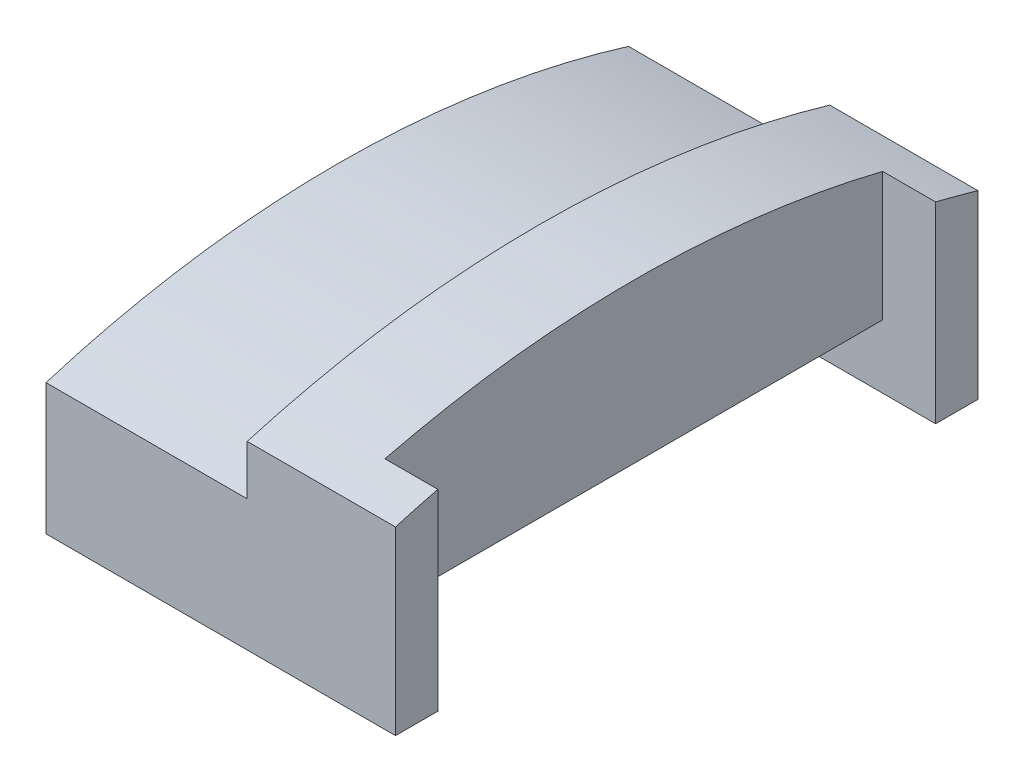
ISO-10303-21;
HEADER;
FILE_DESCRIPTION(('STEP AP214'),'2;1');
FILE_NAME('part.step','',(''),(''),'','','');
FILE_SCHEMA(('AUTOMOTIVE_DESIGN { 1 0 10303 214 1 1 1 1 }'));
ENDSEC;
DATA;
#1=APPLICATION_CONTEXT('core data for automotive mechanical design processes');
#2=APPLICATION_PROTOCOL_DEFINITION('international standard','automotive_design',2000,#1);
#3=PRODUCT_CONTEXT('',#1,'mechanical');
#4=PRODUCT('Part','Part','',(#3));
#5=PRODUCT_RELATED_PRODUCT_CATEGORY('part','',(#4));
#6=PRODUCT_DEFINITION_FORMATION('','',#4);
#7=PRODUCT_DEFINITION_CONTEXT('part definition',#1,'design');
#8=PRODUCT_DEFINITION('design','',#6,#7);
#9=PRODUCT_DEFINITION_SHAPE('','',#8);
#10=(LENGTH_UNIT() NAMED_UNIT(*) SI_UNIT(.MILLI.,.METRE.));
#11=(NAMED_UNIT(*) PLANE_ANGLE_UNIT() SI_UNIT($,.RADIAN.));
#12=(NAMED_UNIT(*) SI_UNIT($,.STERADIAN.) SOLID_ANGLE_UNIT());
#13=UNCERTAINTY_MEASURE_WITH_UNIT(LENGTH_MEASURE(1.E-05),#10,'distance_accuracy_value','');
#14=(GEOMETRIC_REPRESENTATION_CONTEXT(3) GLOBAL_UNCERTAINTY_ASSIGNED_CONTEXT((#13)) GLOBAL_UNIT_ASSIGNED_CONTEXT((#10,
#11,#12)) REPRESENTATION_CONTEXT('',''));
#15=CARTESIAN_POINT('',(0.,0.,0.));
#16=DIRECTION('',(0.,0.,1.));
#17=DIRECTION('',(1.,0.,0.));
#18=AXIS2_PLACEMENT_3D('',#15,#16,#17);
#19=CARTESIAN_POINT('',(44.005,4.85,1.375));
#20=DIRECTION('',(0.,0.,-1.));
#21=DIRECTION('',(-1.,0.,0.));
#22=AXIS2_PLACEMENT_3D('',#19,#20,#21);
#23=PLANE('',#22);
#24=DIRECTION('',(0.,1.,0.));
#25=VECTOR('',#24,1.);
#26=CARTESIAN_POINT('',(44.13,-5.675,1.375));
#27=LINE('',#26,#25);
#28=CARTESIAN_POINT('',(44.13,4.70312396179391,1.375));
#29=VERTEX_POINT('',#28);
#30=CARTESIAN_POINT('',(44.13,4.46822112254978,1.375));
#31=VERTEX_POINT('',#30);
#32=EDGE_CURVE('E104',#29,#31,#27,.F.);
#33=ORIENTED_EDGE('',*,*,#32,.T.);
#34=DIRECTION('',(-1.,0.,0.));
#35=VECTOR('',#34,1.);
#36=CARTESIAN_POINT('',(43.63,4.46822112254978,1.375));
#37=LINE('',#36,#35);
#38=CARTESIAN_POINT('',(43.18,4.46822112254978,1.375));
#39=VERTEX_POINT('',#38);
#40=EDGE_CURVE('E171',#39,#31,#37,.F.);
#41=ORIENTED_EDGE('',*,*,#40,.F.);
#42=DIRECTION('',(0.,1.,0.));
#43=VECTOR('',#42,1.);
#44=CARTESIAN_POINT('',(43.18,4.85,1.375));
#45=LINE('',#44,#43);
#46=CARTESIAN_POINT('',(43.18,3.85,1.375));
#47=VERTEX_POINT('',#46);
#48=EDGE_CURVE('E138',#47,#39,#45,.T.);
#49=ORIENTED_EDGE('',*,*,#48,.F.);
#50=DIRECTION('',(1.,0.,0.));
#51=VECTOR('',#50,1.);
#52=CARTESIAN_POINT('',(44.005,3.85,1.375));
#53=LINE('',#52,#51);
#54=CARTESIAN_POINT('',(44.83,3.85,1.375));
#55=VERTEX_POINT('',#54);
#56=EDGE_CURVE('E142',#47,#55,#53,.T.);
#57=ORIENTED_EDGE('',*,*,#56,.T.);
#58=DIRECTION('',(0.,1.,0.));
#59=VECTOR('',#58,1.);
#60=CARTESIAN_POINT('',(44.83,4.85,1.375));
#61=LINE('',#60,#59);
#62=CARTESIAN_POINT('',(44.83,4.70312396179391,1.375));
#63=VERTEX_POINT('',#62);
#64=EDGE_CURVE('E149',#63,#55,#61,.F.);
#65=ORIENTED_EDGE('',*,*,#64,.F.);
#66=DIRECTION('',(1.,0.,0.));
#67=VECTOR('',#66,1.);
#68=CARTESIAN_POINT('',(44.88,4.70312396179391,1.375));
#69=LINE('',#68,#67);
#70=EDGE_CURVE('E114',#29,#63,#69,.T.);
#71=ORIENTED_EDGE('',*,*,#70,.F.);
#72=EDGE_LOOP('',(#33,#41,#49,#57,#65,#71));
#73=FACE_BOUND('',#72,.T.);
#74=ADVANCED_FACE('F17',(#73),#23,.F.);
#75=CARTESIAN_POINT('',(44.13,-5.675,0.));
#76=DIRECTION('',(1.,0.,0.));
#77=DIRECTION('',(0.,0.,-1.));
#78=AXIS2_PLACEMENT_3D('',#75,#76,#77);
#79=PLANE('',#78);
#80=CARTESIAN_POINT('',(44.13,0.,0.));
#81=DIRECTION('',(1.,0.,0.));
#82=DIRECTION('',(0.,0.,-1.));
#83=AXIS2_PLACEMENT_3D('',#80,#81,#82);
#84=CIRCLE('',#83,4.9);
#85=CARTESIAN_POINT('',(44.13,4.70312396179391,-1.375));
#86=VERTEX_POINT('',#85);
#87=EDGE_CURVE('E20',#86,#29,#84,.T.);
#88=ORIENTED_EDGE('',*,*,#87,.F.);
#89=DIRECTION('',(0.,1.,0.));
#90=VECTOR('',#89,1.);
#91=CARTESIAN_POINT('',(44.13,4.85,-1.375));
#92=LINE('',#91,#90);
#93=CARTESIAN_POINT('',(44.13,4.46822112254978,-1.375));
#94=VERTEX_POINT('',#93);
#95=EDGE_CURVE('E110',#86,#94,#92,.F.);
#96=ORIENTED_EDGE('',*,*,#95,.T.);
#97=CARTESIAN_POINT('',(44.13,0.,0.));
#98=DIRECTION('',(-1.,0.,0.));
#99=DIRECTION('',(0.,0.,1.));
#100=AXIS2_PLACEMENT_3D('',#97,#98,#99);
#101=CIRCLE('',#100,4.675);
#102=EDGE_CURVE('E169',#31,#94,#101,.T.);
#103=ORIENTED_EDGE('',*,*,#102,.F.);
#104=ORIENTED_EDGE('',*,*,#32,.F.);
#105=EDGE_LOOP('',(#88,#96,#103,#104));
#106=FACE_BOUND('',#105,.T.);
#107=ADVANCED_FACE('F109',(#106),#79,.F.);
#108=CARTESIAN_POINT('',(44.005,4.85,-1.375));
#109=DIRECTION('',(0.,0.,1.));
#110=DIRECTION('',(1.,0.,0.));
#111=AXIS2_PLACEMENT_3D('',#108,#109,#110);
#112=PLANE('',#111);
#113=DIRECTION('',(0.,1.,0.));
#114=VECTOR('',#113,1.);
#115=CARTESIAN_POINT('',(44.83,4.85,-1.375));
#116=LINE('',#115,#114);
#117=CARTESIAN_POINT('',(44.83,3.85,-1.375));
#118=VERTEX_POINT('',#117);
#119=CARTESIAN_POINT('',(44.83,4.70312396179391,-1.375));
#120=VERTEX_POINT('',#119);
#121=EDGE_CURVE('E168',#118,#120,#116,.T.);
#122=ORIENTED_EDGE('',*,*,#121,.F.);
#123=DIRECTION('',(1.,0.,0.));
#124=VECTOR('',#123,1.);
#125=CARTESIAN_POINT('',(44.005,3.85,-1.375));
#126=LINE('',#125,#124);
#127=CARTESIAN_POINT('',(43.18,3.85,-1.375));
#128=VERTEX_POINT('',#127);
#129=EDGE_CURVE('E170',#118,#128,#126,.F.);
#130=ORIENTED_EDGE('',*,*,#129,.T.);
#131=DIRECTION('',(0.,1.,0.));
#132=VECTOR('',#131,1.);
#133=CARTESIAN_POINT('',(43.18,4.85,-1.375));
#134=LINE('',#133,#132);
#135=CARTESIAN_POINT('',(43.18,4.46822112254978,-1.375));
#136=VERTEX_POINT('',#135);
#137=EDGE_CURVE('E123',#136,#128,#134,.F.);
#138=ORIENTED_EDGE('',*,*,#137,.F.);
#139=DIRECTION('',(-1.,0.,0.));
#140=VECTOR('',#139,1.);
#141=CARTESIAN_POINT('',(43.63,4.46822112254978,-1.375));
#142=LINE('',#141,#140);
#143=EDGE_CURVE('E122',#94,#136,#142,.T.);
#144=ORIENTED_EDGE('',*,*,#143,.F.);
#145=ORIENTED_EDGE('',*,*,#95,.F.);
#146=DIRECTION('',(1.,0.,0.));
#147=VECTOR('',#146,1.);
#148=CARTESIAN_POINT('',(44.88,4.70312396179391,-1.375));
#149=LINE('',#148,#147);
#150=EDGE_CURVE('E115',#120,#86,#149,.F.);
#151=ORIENTED_EDGE('',*,*,#150,.F.);
#152=EDGE_LOOP('',(#122,#130,#138,#144,#145,#151));
#153=FACE_BOUND('',#152,.T.);
#154=ADVANCED_FACE('F118',(#153),#112,.F.);
#155=CARTESIAN_POINT('',(44.88,0.,0.));
#156=DIRECTION('',(1.,0.,0.));
#157=DIRECTION('',(0.,0.,-1.));
#158=AXIS2_PLACEMENT_3D('',#155,#156,#157);
#159=CYLINDRICAL_SURFACE('',#158,4.9);
#160=DIRECTION('',(1.,0.,0.));
#161=VECTOR('',#160,1.);
#162=CARTESIAN_POINT('',(44.88,4.75703426516984,1.175));
#163=LINE('',#162,#161);
#164=CARTESIAN_POINT('',(44.83,4.75703426516984,1.175));
#165=VERTEX_POINT('',#164);
#166=CARTESIAN_POINT('',(44.58,4.75703426516984,1.175));
#167=VERTEX_POINT('',#166);
#168=EDGE_CURVE('E159',#165,#167,#163,.F.);
#169=ORIENTED_EDGE('',*,*,#168,.T.);
#170=CARTESIAN_POINT('',(44.58,0.,0.));
#171=DIRECTION('',(1.,0.,0.));
#172=DIRECTION('',(0.,0.,-1.));
#173=AXIS2_PLACEMENT_3D('',#170,#171,#172);
#174=CIRCLE('',#173,4.9);
#175=CARTESIAN_POINT('',(44.58,4.75703426516984,-1.175));
#176=VERTEX_POINT('',#175);
#177=EDGE_CURVE('E163',#176,#167,#174,.T.);
#178=ORIENTED_EDGE('',*,*,#177,.F.);
#179=DIRECTION('',(1.,0.,0.));
#180=VECTOR('',#179,1.);
#181=CARTESIAN_POINT('',(44.88,4.75703426516984,-1.175));
#182=LINE('',#181,#180);
#183=CARTESIAN_POINT('',(44.83,4.75703426516984,-1.175));
#184=VERTEX_POINT('',#183);
#185=EDGE_CURVE('E129',#176,#184,#182,.T.);
#186=ORIENTED_EDGE('',*,*,#185,.T.);
#187=CARTESIAN_POINT('',(44.83,0.,0.));
#188=DIRECTION('',(1.,0.,0.));
#189=DIRECTION('',(0.,0.,-1.));
#190=AXIS2_PLACEMENT_3D('',#187,#188,#189);
#191=CIRCLE('',#190,4.9);
#192=EDGE_CURVE('E127',#120,#184,#191,.T.);
#193=ORIENTED_EDGE('',*,*,#192,.F.);
#194=ORIENTED_EDGE('',*,*,#150,.T.);
#195=ORIENTED_EDGE('',*,*,#87,.T.);
#196=ORIENTED_EDGE('',*,*,#70,.T.);
#197=CARTESIAN_POINT('',(44.83,0.,0.));
#198=DIRECTION('',(1.,0.,0.));
#199=DIRECTION('',(0.,0.,-1.));
#200=AXIS2_PLACEMENT_3D('',#197,#198,#199);
#201=CIRCLE('',#200,4.9);
#202=EDGE_CURVE('E172',#165,#63,#201,.T.);
#203=ORIENTED_EDGE('',*,*,#202,.F.);
#204=EDGE_LOOP('',(#169,#178,#186,#193,#194,#195,#196,#203));
#205=FACE_BOUND('',#204,.T.);
#206=ADVANCED_FACE('F125',(#205),#159,.T.);
#207=CARTESIAN_POINT('',(44.83,4.85,0.));
#208=DIRECTION('',(1.,0.,0.));
#209=DIRECTION('',(0.,0.,-1.));
#210=AXIS2_PLACEMENT_3D('',#207,#208,#209);
#211=PLANE('',#210);
#212=ORIENTED_EDGE('',*,*,#64,.T.);
#213=DIRECTION('',(0.,0.,1.));
#214=VECTOR('',#213,1.);
#215=CARTESIAN_POINT('',(44.83,3.85,0.));
#216=LINE('',#215,#214);
#217=CARTESIAN_POINT('',(44.83,3.85,1.175));
#218=VERTEX_POINT('',#217);
#219=EDGE_CURVE('E144',#55,#218,#216,.F.);
#220=ORIENTED_EDGE('',*,*,#219,.T.);
#221=DIRECTION('',(0.,1.,0.));
#222=VECTOR('',#221,1.);
#223=CARTESIAN_POINT('',(44.83,3.65,1.175));
#224=LINE('',#223,#222);
#225=EDGE_CURVE('E190',#165,#218,#224,.F.);
#226=ORIENTED_EDGE('',*,*,#225,.F.);
#227=ORIENTED_EDGE('',*,*,#202,.T.);
#228=EDGE_LOOP('',(#212,#220,#226,#227));
#229=FACE_BOUND('',#228,.T.);
#230=ADVANCED_FACE('F264',(#229),#211,.T.);
#231=CARTESIAN_POINT('',(44.005,3.85,0.));
#232=DIRECTION('',(0.,1.,0.));
#233=DIRECTION('',(0.,0.,1.));
#234=AXIS2_PLACEMENT_3D('',#231,#232,#233);
#235=PLANE('',#234);
#236=ORIENTED_EDGE('',*,*,#219,.F.);
#237=ORIENTED_EDGE('',*,*,#56,.F.);
#238=DIRECTION('',(0.,0.,1.));
#239=VECTOR('',#238,1.);
#240=CARTESIAN_POINT('',(43.18,3.85,0.));
#241=LINE('',#240,#239);
#242=CARTESIAN_POINT('',(43.18,3.85,1.175));
#243=VERTEX_POINT('',#242);
#244=EDGE_CURVE('E145',#243,#47,#241,.T.);
#245=ORIENTED_EDGE('',*,*,#244,.F.);
#246=DIRECTION('',(-1.,0.,0.));
#247=VECTOR('',#246,1.);
#248=CARTESIAN_POINT('',(44.33,3.85,1.175));
#249=LINE('',#248,#247);
#250=EDGE_CURVE('E196',#218,#243,#249,.T.);
#251=ORIENTED_EDGE('',*,*,#250,.F.);
#252=EDGE_LOOP('',(#236,#237,#245,#251));
#253=FACE_BOUND('',#252,.T.);
#254=ADVANCED_FACE('F259',(#253),#235,.F.);
#255=CARTESIAN_POINT('',(43.63,0.,0.));
#256=DIRECTION('',(-1.,0.,0.));
#257=DIRECTION('',(0.,0.,1.));
#258=AXIS2_PLACEMENT_3D('',#255,#256,#257);
#259=CYLINDRICAL_SURFACE('',#258,4.675);
#260=ORIENTED_EDGE('',*,*,#40,.T.);
#261=ORIENTED_EDGE('',*,*,#102,.T.);
#262=ORIENTED_EDGE('',*,*,#143,.T.);
#263=CARTESIAN_POINT('',(43.18,0.,0.));
#264=DIRECTION('',(-1.,0.,0.));
#265=DIRECTION('',(0.,0.,1.));
#266=AXIS2_PLACEMENT_3D('',#263,#264,#265);
#267=CIRCLE('',#266,4.675);
#268=EDGE_CURVE('E155',#136,#39,#267,.F.);
#269=ORIENTED_EDGE('',*,*,#268,.T.);
#270=EDGE_LOOP('',(#260,#261,#262,#269));
#271=FACE_BOUND('',#270,.T.);
#272=ADVANCED_FACE('F272',(#271),#259,.T.);
#273=CARTESIAN_POINT('',(44.005,3.85,0.));
#274=DIRECTION('',(0.,1.,0.));
#275=DIRECTION('',(0.,0.,1.));
#276=AXIS2_PLACEMENT_3D('',#273,#274,#275);
#277=PLANE('',#276);
#278=DIRECTION('',(0.,0.,-1.));
#279=VECTOR('',#278,1.);
#280=CARTESIAN_POINT('',(43.18,3.85,0.));
#281=LINE('',#280,#279);
#282=CARTESIAN_POINT('',(43.18,3.85,-1.175));
#283=VERTEX_POINT('',#282);
#284=EDGE_CURVE('E162',#283,#128,#281,.T.);
#285=ORIENTED_EDGE('',*,*,#284,.T.);
#286=ORIENTED_EDGE('',*,*,#129,.F.);
#287=DIRECTION('',(0.,0.,-1.));
#288=VECTOR('',#287,1.);
#289=CARTESIAN_POINT('',(44.83,3.85,0.));
#290=LINE('',#289,#288);
#291=CARTESIAN_POINT('',(44.83,3.85,-1.175));
#292=VERTEX_POINT('',#291);
#293=EDGE_CURVE('E209',#292,#118,#290,.T.);
#294=ORIENTED_EDGE('',*,*,#293,.F.);
#295=DIRECTION('',(1.,0.,0.));
#296=VECTOR('',#295,1.);
#297=CARTESIAN_POINT('',(44.33,3.85,-1.175));
#298=LINE('',#297,#296);
#299=EDGE_CURVE('E154',#283,#292,#298,.T.);
#300=ORIENTED_EDGE('',*,*,#299,.F.);
#301=EDGE_LOOP('',(#285,#286,#294,#300));
#302=FACE_BOUND('',#301,.T.);
#303=ADVANCED_FACE('F295',(#302),#277,.F.);
#304=CARTESIAN_POINT('',(44.83,4.85,0.));
#305=DIRECTION('',(1.,0.,0.));
#306=DIRECTION('',(0.,0.,-1.));
#307=AXIS2_PLACEMENT_3D('',#304,#305,#306);
#308=PLANE('',#307);
#309=ORIENTED_EDGE('',*,*,#121,.T.);
#310=ORIENTED_EDGE('',*,*,#192,.T.);
#311=DIRECTION('',(0.,1.,0.));
#312=VECTOR('',#311,1.);
#313=CARTESIAN_POINT('',(44.83,3.65,-1.175));
#314=LINE('',#313,#312);
#315=EDGE_CURVE('E225',#292,#184,#314,.T.);
#316=ORIENTED_EDGE('',*,*,#315,.F.);
#317=ORIENTED_EDGE('',*,*,#293,.T.);
#318=EDGE_LOOP('',(#309,#310,#316,#317));
#319=FACE_BOUND('',#318,.T.);
#320=ADVANCED_FACE('F291',(#319),#308,.T.);
#321=CARTESIAN_POINT('',(44.58,6.35,0.));
#322=DIRECTION('',(1.,0.,0.));
#323=DIRECTION('',(0.,0.,-1.));
#324=AXIS2_PLACEMENT_3D('',#321,#322,#323);
#325=PLANE('',#324);
#326=ORIENTED_EDGE('',*,*,#177,.T.);
#327=DIRECTION('',(0.,1.,0.));
#328=VECTOR('',#327,1.);
#329=CARTESIAN_POINT('',(44.58,3.65,1.175));
#330=LINE('',#329,#328);
#331=CARTESIAN_POINT('',(44.58,4.15,1.175));
#332=VERTEX_POINT('',#331);
#333=EDGE_CURVE('E166',#332,#167,#330,.T.);
#334=ORIENTED_EDGE('',*,*,#333,.F.);
#335=DIRECTION('',(0.,0.,-1.));
#336=VECTOR('',#335,1.);
#337=CARTESIAN_POINT('',(44.58,4.15,0.));
#338=LINE('',#337,#336);
#339=CARTESIAN_POINT('',(44.58,4.15,-1.175));
#340=VERTEX_POINT('',#339);
#341=EDGE_CURVE('E185',#340,#332,#338,.F.);
#342=ORIENTED_EDGE('',*,*,#341,.F.);
#343=DIRECTION('',(0.,1.,0.));
#344=VECTOR('',#343,1.);
#345=CARTESIAN_POINT('',(44.58,3.65,-1.175));
#346=LINE('',#345,#344);
#347=EDGE_CURVE('E216',#176,#340,#346,.F.);
#348=ORIENTED_EDGE('',*,*,#347,.F.);
#349=EDGE_LOOP('',(#326,#334,#342,#348));
#350=FACE_BOUND('',#349,.T.);
#351=ADVANCED_FACE('F288',(#350),#325,.T.);
#352=CARTESIAN_POINT('',(44.33,3.65,1.175));
#353=DIRECTION('',(0.,0.,-1.));
#354=DIRECTION('',(-1.,0.,0.));
#355=AXIS2_PLACEMENT_3D('',#352,#353,#354);
#356=PLANE('',#355);
#357=ORIENTED_EDGE('',*,*,#250,.T.);
#358=DIRECTION('',(0.,1.,0.));
#359=VECTOR('',#358,1.);
#360=CARTESIAN_POINT('',(43.18,4.85,1.175));
#361=LINE('',#360,#359);
#362=CARTESIAN_POINT('',(43.18,4.15,1.175));
#363=VERTEX_POINT('',#362);
#364=EDGE_CURVE('E152',#243,#363,#361,.T.);
#365=ORIENTED_EDGE('',*,*,#364,.T.);
#366=DIRECTION('',(1.,0.,0.));
#367=VECTOR('',#366,1.);
#368=CARTESIAN_POINT('',(44.33,4.15,1.175));
#369=LINE('',#368,#367);
#370=EDGE_CURVE('E182',#332,#363,#369,.F.);
#371=ORIENTED_EDGE('',*,*,#370,.F.);
#372=ORIENTED_EDGE('',*,*,#333,.T.);
#373=ORIENTED_EDGE('',*,*,#168,.F.);
#374=ORIENTED_EDGE('',*,*,#225,.T.);
#375=EDGE_LOOP('',(#357,#365,#371,#372,#373,#374));
#376=FACE_BOUND('',#375,.T.);
#377=ADVANCED_FACE('F255',(#376),#356,.T.);
#378=CARTESIAN_POINT('',(43.18,4.85,0.));
#379=DIRECTION('',(1.,0.,0.));
#380=DIRECTION('',(0.,0.,-1.));
#381=AXIS2_PLACEMENT_3D('',#378,#379,#380);
#382=PLANE('',#381);
#383=DIRECTION('',(0.,0.,-1.));
#384=VECTOR('',#383,1.);
#385=CARTESIAN_POINT('',(43.18,4.15,0.));
#386=LINE('',#385,#384);
#387=CARTESIAN_POINT('',(43.18,4.15,-1.175));
#388=VERTEX_POINT('',#387);
#389=EDGE_CURVE('E26',#363,#388,#386,.T.);
#390=ORIENTED_EDGE('',*,*,#389,.F.);
#391=ORIENTED_EDGE('',*,*,#364,.F.);
#392=ORIENTED_EDGE('',*,*,#244,.T.);
#393=ORIENTED_EDGE('',*,*,#48,.T.);
#394=ORIENTED_EDGE('',*,*,#268,.F.);
#395=ORIENTED_EDGE('',*,*,#137,.T.);
#396=ORIENTED_EDGE('',*,*,#284,.F.);
#397=DIRECTION('',(0.,1.,0.));
#398=VECTOR('',#397,1.);
#399=CARTESIAN_POINT('',(43.18,3.65,-1.175));
#400=LINE('',#399,#398);
#401=EDGE_CURVE('E35',#388,#283,#400,.F.);
#402=ORIENTED_EDGE('',*,*,#401,.F.);
#403=EDGE_LOOP('',(#390,#391,#392,#393,#394,#395,#396,#402));
#404=FACE_BOUND('',#403,.T.);
#405=ADVANCED_FACE('F252',(#404),#382,.F.);
#406=CARTESIAN_POINT('',(44.33,3.65,-1.175));
#407=DIRECTION('',(0.,0.,1.));
#408=DIRECTION('',(1.,0.,0.));
#409=AXIS2_PLACEMENT_3D('',#406,#407,#408);
#410=PLANE('',#409);
#411=DIRECTION('',(1.,0.,0.));
#412=VECTOR('',#411,1.);
#413=CARTESIAN_POINT('',(44.33,4.15,-1.175));
#414=LINE('',#413,#412);
#415=EDGE_CURVE('E11',#388,#340,#414,.T.);
#416=ORIENTED_EDGE('',*,*,#415,.F.);
#417=ORIENTED_EDGE('',*,*,#401,.T.);
#418=ORIENTED_EDGE('',*,*,#299,.T.);
#419=ORIENTED_EDGE('',*,*,#315,.T.);
#420=ORIENTED_EDGE('',*,*,#185,.F.);
#421=ORIENTED_EDGE('',*,*,#347,.T.);
#422=EDGE_LOOP('',(#416,#417,#418,#419,#420,#421));
#423=FACE_BOUND('',#422,.T.);
#424=ADVANCED_FACE('F276',(#423),#410,.T.);
#425=CARTESIAN_POINT('',(44.33,4.15,0.));
#426=DIRECTION('',(0.,-1.,0.));
#427=DIRECTION('',(0.,0.,-1.));
#428=AXIS2_PLACEMENT_3D('',#425,#426,#427);
#429=PLANE('',#428);
#430=ORIENTED_EDGE('',*,*,#389,.T.);
#431=ORIENTED_EDGE('',*,*,#415,.T.);
#432=ORIENTED_EDGE('',*,*,#341,.T.);
#433=ORIENTED_EDGE('',*,*,#370,.T.);
#434=EDGE_LOOP('',(#430,#431,#432,#433));
#435=FACE_BOUND('',#434,.T.);
#436=ADVANCED_FACE('F249',(#435),#429,.T.);
#437=CLOSED_SHELL('',(#74,#107,#154,#206,#230,#254,#272,#303,#320,#351,#377,#405,#424,#436));
#438=MANIFOLD_SOLID_BREP('B1',#437);
#439=ADVANCED_BREP_SHAPE_REPRESENTATION('',(#18,#438),#14);
#440=SHAPE_DEFINITION_REPRESENTATION(#9,#439);
ENDSEC;
END-ISO-10303-21;
